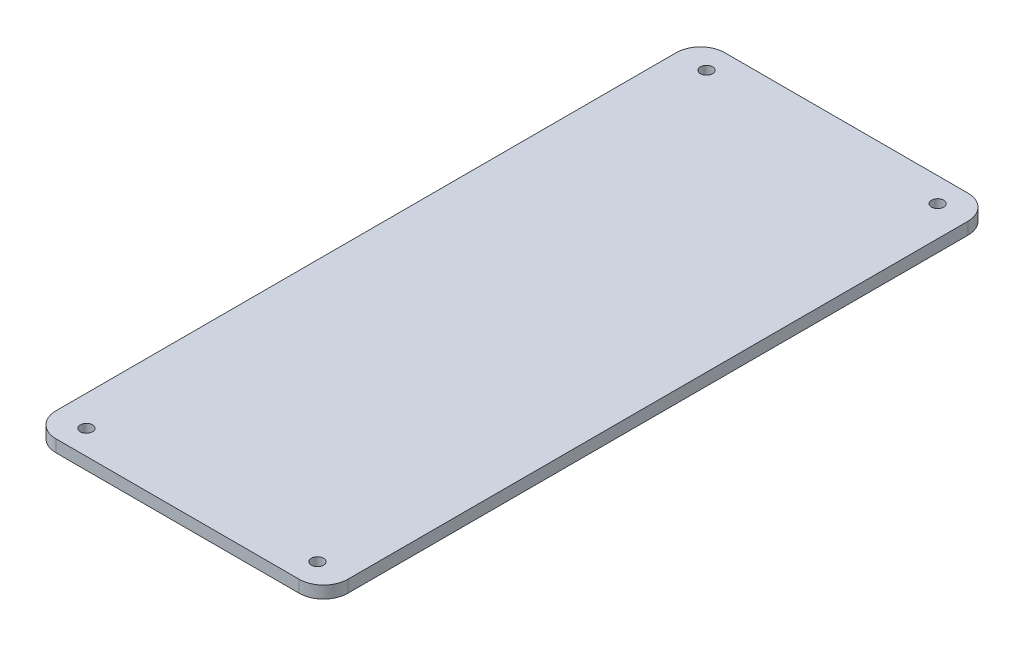
ISO-10303-21;
HEADER;
FILE_DESCRIPTION(('STEP AP214'),'2;1');
FILE_NAME('part.step','',(''),(''),'','','');
FILE_SCHEMA(('AUTOMOTIVE_DESIGN { 1 0 10303 214 1 1 1 1 }'));
ENDSEC;
DATA;
#1=APPLICATION_CONTEXT('core data for automotive mechanical design processes');
#2=APPLICATION_PROTOCOL_DEFINITION('international standard','automotive_design',2000,#1);
#3=PRODUCT_CONTEXT('',#1,'mechanical');
#4=PRODUCT('Part','Part','',(#3));
#5=PRODUCT_RELATED_PRODUCT_CATEGORY('part','',(#4));
#6=PRODUCT_DEFINITION_FORMATION('','',#4);
#7=PRODUCT_DEFINITION_CONTEXT('part definition',#1,'design');
#8=PRODUCT_DEFINITION('design','',#6,#7);
#9=PRODUCT_DEFINITION_SHAPE('','',#8);
#10=(LENGTH_UNIT() NAMED_UNIT(*) SI_UNIT(.MILLI.,.METRE.));
#11=(NAMED_UNIT(*) PLANE_ANGLE_UNIT() SI_UNIT($,.RADIAN.));
#12=(NAMED_UNIT(*) SI_UNIT($,.STERADIAN.) SOLID_ANGLE_UNIT());
#13=UNCERTAINTY_MEASURE_WITH_UNIT(LENGTH_MEASURE(1.E-05),#10,'distance_accuracy_value','');
#14=(GEOMETRIC_REPRESENTATION_CONTEXT(3) GLOBAL_UNCERTAINTY_ASSIGNED_CONTEXT((#13)) GLOBAL_UNIT_ASSIGNED_CONTEXT((#10,
#11,#12)) REPRESENTATION_CONTEXT('',''));
#15=CARTESIAN_POINT('',(0.,0.,0.));
#16=DIRECTION('',(0.,0.,1.));
#17=DIRECTION('',(1.,0.,0.));
#18=AXIS2_PLACEMENT_3D('',#15,#16,#17);
#19=CARTESIAN_POINT('',(30.,3.,-76.5));
#20=DIRECTION('',(0.,-1.,0.));
#21=DIRECTION('',(0.,0.,-1.));
#22=AXIS2_PLACEMENT_3D('',#19,#20,#21);
#23=PLANE('',#22);
#24=CARTESIAN_POINT('',(30.,3.,-76.5));
#25=DIRECTION('',(0.,1.,0.));
#26=DIRECTION('',(0.,0.,-1.));
#27=AXIS2_PLACEMENT_3D('',#24,#25,#26);
#28=CIRCLE('',#27,5.99999999999999);
#29=CARTESIAN_POINT('',(36.,3.,-76.5));
#30=VERTEX_POINT('',#29);
#31=CARTESIAN_POINT('',(30.,3.,-82.5));
#32=VERTEX_POINT('',#31);
#33=EDGE_CURVE('E151',#30,#32,#28,.T.);
#34=ORIENTED_EDGE('',*,*,#33,.T.);
#35=DIRECTION('',(-1.,0.,0.));
#36=VECTOR('',#35,1.);
#37=CARTESIAN_POINT('',(-30.,3.,-82.5));
#38=LINE('',#37,#36);
#39=CARTESIAN_POINT('',(-30.,3.,-82.5));
#40=VERTEX_POINT('',#39);
#41=EDGE_CURVE('E99',#32,#40,#38,.T.);
#42=ORIENTED_EDGE('',*,*,#41,.T.);
#43=CARTESIAN_POINT('',(-30.,3.,-76.5));
#44=DIRECTION('',(0.,1.,0.));
#45=DIRECTION('',(0.,0.,-1.));
#46=AXIS2_PLACEMENT_3D('',#43,#44,#45);
#47=CIRCLE('',#46,6.);
#48=CARTESIAN_POINT('',(-36.,3.,-76.5));
#49=VERTEX_POINT('',#48);
#50=EDGE_CURVE('E166',#40,#49,#47,.T.);
#51=ORIENTED_EDGE('',*,*,#50,.T.);
#52=DIRECTION('',(0.,0.,1.));
#53=VECTOR('',#52,1.);
#54=CARTESIAN_POINT('',(-36.,3.,76.5));
#55=LINE('',#54,#53);
#56=CARTESIAN_POINT('',(-36.,3.,76.5));
#57=VERTEX_POINT('',#56);
#58=EDGE_CURVE('E179',#49,#57,#55,.T.);
#59=ORIENTED_EDGE('',*,*,#58,.T.);
#60=CARTESIAN_POINT('',(-30.,3.,76.5));
#61=DIRECTION('',(0.,1.,0.));
#62=DIRECTION('',(0.,0.,-1.));
#63=AXIS2_PLACEMENT_3D('',#60,#61,#62);
#64=CIRCLE('',#63,6.00000000000001);
#65=CARTESIAN_POINT('',(-30.,3.,82.5));
#66=VERTEX_POINT('',#65);
#67=EDGE_CURVE('E118',#57,#66,#64,.T.);
#68=ORIENTED_EDGE('',*,*,#67,.T.);
#69=DIRECTION('',(1.,0.,0.));
#70=VECTOR('',#69,1.);
#71=CARTESIAN_POINT('',(-30.,3.,82.5));
#72=LINE('',#71,#70);
#73=CARTESIAN_POINT('',(30.,3.,82.5));
#74=VERTEX_POINT('',#73);
#75=EDGE_CURVE('E112',#66,#74,#72,.T.);
#76=ORIENTED_EDGE('',*,*,#75,.T.);
#77=CARTESIAN_POINT('',(30.,3.,76.5));
#78=DIRECTION('',(0.,1.,0.));
#79=DIRECTION('',(0.,0.,-1.));
#80=AXIS2_PLACEMENT_3D('',#77,#78,#79);
#81=CIRCLE('',#80,6.00000000000001);
#82=CARTESIAN_POINT('',(36.,3.,76.5));
#83=VERTEX_POINT('',#82);
#84=EDGE_CURVE('E116',#74,#83,#81,.T.);
#85=ORIENTED_EDGE('',*,*,#84,.T.);
#86=DIRECTION('',(0.,0.,-1.));
#87=VECTOR('',#86,1.);
#88=CARTESIAN_POINT('',(36.,3.,76.5));
#89=LINE('',#88,#87);
#90=EDGE_CURVE('E56',#83,#30,#89,.T.);
#91=ORIENTED_EDGE('',*,*,#90,.T.);
#92=EDGE_LOOP('',(#34,#42,#51,#59,#68,#76,#85,#91));
#93=FACE_BOUND('',#92,.T.);
#94=CARTESIAN_POINT('',(28.5,3.,76.5));
#95=DIRECTION('',(0.,1.,0.));
#96=DIRECTION('',(0.,0.,1.));
#97=AXIS2_PLACEMENT_3D('',#94,#95,#96);
#98=CIRCLE('',#97,1.50000000000005);
#99=CARTESIAN_POINT('',(28.5,3.,78.0000000000001));
#100=VERTEX_POINT('',#99);
#101=EDGE_CURVE('E140',#100,#100,#98,.T.);
#102=ORIENTED_EDGE('',*,*,#101,.F.);
#103=EDGE_LOOP('',(#102));
#104=FACE_BOUND('',#103,.T.);
#105=CARTESIAN_POINT('',(-28.5,3.,76.5));
#106=DIRECTION('',(0.,1.,0.));
#107=DIRECTION('',(0.,0.,1.));
#108=AXIS2_PLACEMENT_3D('',#105,#106,#107);
#109=CIRCLE('',#108,1.50000000000005);
#110=CARTESIAN_POINT('',(-28.5,3.,78.0000000000001));
#111=VERTEX_POINT('',#110);
#112=EDGE_CURVE('E188',#111,#111,#109,.T.);
#113=ORIENTED_EDGE('',*,*,#112,.F.);
#114=EDGE_LOOP('',(#113));
#115=FACE_BOUND('',#114,.T.);
#116=CARTESIAN_POINT('',(28.5,3.,-76.5));
#117=DIRECTION('',(0.,1.,0.));
#118=DIRECTION('',(0.,0.,1.));
#119=AXIS2_PLACEMENT_3D('',#116,#117,#118);
#120=CIRCLE('',#119,1.50000000000008);
#121=CARTESIAN_POINT('',(28.5,3.,-74.9999999999999));
#122=VERTEX_POINT('',#121);
#123=EDGE_CURVE('E194',#122,#122,#120,.T.);
#124=ORIENTED_EDGE('',*,*,#123,.F.);
#125=EDGE_LOOP('',(#124));
#126=FACE_BOUND('',#125,.T.);
#127=CARTESIAN_POINT('',(-28.5000000000001,3.,-76.5));
#128=DIRECTION('',(0.,1.,0.));
#129=DIRECTION('',(0.,0.,1.));
#130=AXIS2_PLACEMENT_3D('',#127,#128,#129);
#131=CIRCLE('',#130,1.50000000000008);
#132=CARTESIAN_POINT('',(-28.5000000000001,3.,-74.9999999999999));
#133=VERTEX_POINT('',#132);
#134=EDGE_CURVE('E200',#133,#133,#131,.T.);
#135=ORIENTED_EDGE('',*,*,#134,.F.);
#136=EDGE_LOOP('',(#135));
#137=FACE_BOUND('',#136,.T.);
#138=ADVANCED_FACE('F39',(#93,#104,#115,#126,#137),#23,.F.);
#139=CARTESIAN_POINT('',(30.,0.,-76.5));
#140=DIRECTION('',(0.,-1.,0.));
#141=DIRECTION('',(0.,0.,-1.));
#142=AXIS2_PLACEMENT_3D('',#139,#140,#141);
#143=PLANE('',#142);
#144=CARTESIAN_POINT('',(28.5,0.,-76.5));
#145=DIRECTION('',(0.,1.,0.));
#146=DIRECTION('',(0.,0.,1.));
#147=AXIS2_PLACEMENT_3D('',#144,#145,#146);
#148=CIRCLE('',#147,1.50000000000008);
#149=CARTESIAN_POINT('',(28.5,0.,-74.9999999999999));
#150=VERTEX_POINT('',#149);
#151=EDGE_CURVE('E197',#150,#150,#148,.T.);
#152=ORIENTED_EDGE('',*,*,#151,.T.);
#153=EDGE_LOOP('',(#152));
#154=FACE_BOUND('',#153,.T.);
#155=CARTESIAN_POINT('',(28.5,0.,76.5));
#156=DIRECTION('',(0.,1.,0.));
#157=DIRECTION('',(0.,0.,1.));
#158=AXIS2_PLACEMENT_3D('',#155,#156,#157);
#159=CIRCLE('',#158,1.50000000000005);
#160=CARTESIAN_POINT('',(28.5,0.,78.0000000000001));
#161=VERTEX_POINT('',#160);
#162=EDGE_CURVE('E185',#161,#161,#159,.T.);
#163=ORIENTED_EDGE('',*,*,#162,.T.);
#164=EDGE_LOOP('',(#163));
#165=FACE_BOUND('',#164,.T.);
#166=CARTESIAN_POINT('',(30.,0.,-76.5));
#167=DIRECTION('',(0.,1.,0.));
#168=DIRECTION('',(0.,0.,-1.));
#169=AXIS2_PLACEMENT_3D('',#166,#167,#168);
#170=CIRCLE('',#169,5.99999999999999);
#171=CARTESIAN_POINT('',(36.,0.,-76.5));
#172=VERTEX_POINT('',#171);
#173=CARTESIAN_POINT('',(30.,0.,-82.5));
#174=VERTEX_POINT('',#173);
#175=EDGE_CURVE('E136',#172,#174,#170,.T.);
#176=ORIENTED_EDGE('',*,*,#175,.F.);
#177=DIRECTION('',(0.,0.,-1.));
#178=VECTOR('',#177,1.);
#179=CARTESIAN_POINT('',(36.,0.,76.5));
#180=LINE('',#179,#178);
#181=CARTESIAN_POINT('',(36.,0.,76.5));
#182=VERTEX_POINT('',#181);
#183=EDGE_CURVE('E91',#182,#172,#180,.T.);
#184=ORIENTED_EDGE('',*,*,#183,.F.);
#185=CARTESIAN_POINT('',(30.,0.,76.5));
#186=DIRECTION('',(0.,1.,0.));
#187=DIRECTION('',(0.,0.,-1.));
#188=AXIS2_PLACEMENT_3D('',#185,#186,#187);
#189=CIRCLE('',#188,6.00000000000001);
#190=CARTESIAN_POINT('',(30.,0.,82.5));
#191=VERTEX_POINT('',#190);
#192=EDGE_CURVE('E85',#191,#182,#189,.T.);
#193=ORIENTED_EDGE('',*,*,#192,.F.);
#194=DIRECTION('',(1.,0.,0.));
#195=VECTOR('',#194,1.);
#196=CARTESIAN_POINT('',(-30.,0.,82.5));
#197=LINE('',#196,#195);
#198=CARTESIAN_POINT('',(-30.,0.,82.5));
#199=VERTEX_POINT('',#198);
#200=EDGE_CURVE('E126',#199,#191,#197,.T.);
#201=ORIENTED_EDGE('',*,*,#200,.F.);
#202=CARTESIAN_POINT('',(-30.,0.,76.5));
#203=DIRECTION('',(0.,1.,0.));
#204=DIRECTION('',(0.,0.,-1.));
#205=AXIS2_PLACEMENT_3D('',#202,#203,#204);
#206=CIRCLE('',#205,6.00000000000001);
#207=CARTESIAN_POINT('',(-36.,0.,76.5));
#208=VERTEX_POINT('',#207);
#209=EDGE_CURVE('E146',#208,#199,#206,.T.);
#210=ORIENTED_EDGE('',*,*,#209,.F.);
#211=DIRECTION('',(0.,0.,1.));
#212=VECTOR('',#211,1.);
#213=CARTESIAN_POINT('',(-36.,0.,76.5));
#214=LINE('',#213,#212);
#215=CARTESIAN_POINT('',(-36.,0.,-76.5));
#216=VERTEX_POINT('',#215);
#217=EDGE_CURVE('E144',#216,#208,#214,.T.);
#218=ORIENTED_EDGE('',*,*,#217,.F.);
#219=CARTESIAN_POINT('',(-30.,0.,-76.5));
#220=DIRECTION('',(0.,1.,0.));
#221=DIRECTION('',(0.,0.,-1.));
#222=AXIS2_PLACEMENT_3D('',#219,#220,#221);
#223=CIRCLE('',#222,6.);
#224=CARTESIAN_POINT('',(-30.,0.,-82.5));
#225=VERTEX_POINT('',#224);
#226=EDGE_CURVE('E142',#225,#216,#223,.T.);
#227=ORIENTED_EDGE('',*,*,#226,.F.);
#228=DIRECTION('',(-1.,0.,0.));
#229=VECTOR('',#228,1.);
#230=CARTESIAN_POINT('',(-30.,0.,-82.5));
#231=LINE('',#230,#229);
#232=EDGE_CURVE('E139',#174,#225,#231,.T.);
#233=ORIENTED_EDGE('',*,*,#232,.F.);
#234=EDGE_LOOP('',(#176,#184,#193,#201,#210,#218,#227,#233));
#235=FACE_BOUND('',#234,.T.);
#236=CARTESIAN_POINT('',(-28.5,0.,76.5));
#237=DIRECTION('',(0.,1.,0.));
#238=DIRECTION('',(0.,0.,1.));
#239=AXIS2_PLACEMENT_3D('',#236,#237,#238);
#240=CIRCLE('',#239,1.50000000000005);
#241=CARTESIAN_POINT('',(-28.5,0.,78.0000000000001));
#242=VERTEX_POINT('',#241);
#243=EDGE_CURVE('E191',#242,#242,#240,.T.);
#244=ORIENTED_EDGE('',*,*,#243,.T.);
#245=EDGE_LOOP('',(#244));
#246=FACE_BOUND('',#245,.T.);
#247=CARTESIAN_POINT('',(-28.5000000000001,0.,-76.5));
#248=DIRECTION('',(0.,1.,0.));
#249=DIRECTION('',(0.,0.,1.));
#250=AXIS2_PLACEMENT_3D('',#247,#248,#249);
#251=CIRCLE('',#250,1.50000000000008);
#252=CARTESIAN_POINT('',(-28.5000000000001,0.,-74.9999999999999));
#253=VERTEX_POINT('',#252);
#254=EDGE_CURVE('E203',#253,#253,#251,.T.);
#255=ORIENTED_EDGE('',*,*,#254,.T.);
#256=EDGE_LOOP('',(#255));
#257=FACE_BOUND('',#256,.T.);
#258=ADVANCED_FACE('F170',(#154,#165,#235,#246,#257),#143,.T.);
#259=CARTESIAN_POINT('',(30.,3.,-76.5));
#260=DIRECTION('',(0.,-1.,0.));
#261=DIRECTION('',(0.,0.,-1.));
#262=AXIS2_PLACEMENT_3D('',#259,#260,#261);
#263=CYLINDRICAL_SURFACE('',#262,5.99999999999999);
#264=ORIENTED_EDGE('',*,*,#175,.T.);
#265=DIRECTION('',(0.,-1.,0.));
#266=VECTOR('',#265,1.);
#267=CARTESIAN_POINT('',(30.,3.,-82.5));
#268=LINE('',#267,#266);
#269=EDGE_CURVE('E11',#32,#174,#268,.T.);
#270=ORIENTED_EDGE('',*,*,#269,.F.);
#271=ORIENTED_EDGE('',*,*,#33,.F.);
#272=DIRECTION('',(0.,-1.,0.));
#273=VECTOR('',#272,1.);
#274=CARTESIAN_POINT('',(36.,3.,-76.5));
#275=LINE('',#274,#273);
#276=EDGE_CURVE('E132',#30,#172,#275,.T.);
#277=ORIENTED_EDGE('',*,*,#276,.T.);
#278=EDGE_LOOP('',(#264,#270,#271,#277));
#279=FACE_BOUND('',#278,.T.);
#280=ADVANCED_FACE('F41',(#279),#263,.T.);
#281=CARTESIAN_POINT('',(-30.,3.,-82.5));
#282=DIRECTION('',(0.,0.,1.));
#283=DIRECTION('',(1.,0.,0.));
#284=AXIS2_PLACEMENT_3D('',#281,#282,#283);
#285=PLANE('',#284);
#286=ORIENTED_EDGE('',*,*,#232,.T.);
#287=DIRECTION('',(0.,-1.,0.));
#288=VECTOR('',#287,1.);
#289=CARTESIAN_POINT('',(-30.,3.,-82.5));
#290=LINE('',#289,#288);
#291=EDGE_CURVE('E48',#40,#225,#290,.T.);
#292=ORIENTED_EDGE('',*,*,#291,.F.);
#293=ORIENTED_EDGE('',*,*,#41,.F.);
#294=ORIENTED_EDGE('',*,*,#269,.T.);
#295=EDGE_LOOP('',(#286,#292,#293,#294));
#296=FACE_BOUND('',#295,.T.);
#297=ADVANCED_FACE('F235',(#296),#285,.F.);
#298=CARTESIAN_POINT('',(-30.,3.,-76.5));
#299=DIRECTION('',(0.,-1.,0.));
#300=DIRECTION('',(0.,0.,-1.));
#301=AXIS2_PLACEMENT_3D('',#298,#299,#300);
#302=CYLINDRICAL_SURFACE('',#301,6.);
#303=ORIENTED_EDGE('',*,*,#226,.T.);
#304=DIRECTION('',(0.,-1.,0.));
#305=VECTOR('',#304,1.);
#306=CARTESIAN_POINT('',(-36.,3.,-76.5));
#307=LINE('',#306,#305);
#308=EDGE_CURVE('E158',#49,#216,#307,.T.);
#309=ORIENTED_EDGE('',*,*,#308,.F.);
#310=ORIENTED_EDGE('',*,*,#50,.F.);
#311=ORIENTED_EDGE('',*,*,#291,.T.);
#312=EDGE_LOOP('',(#303,#309,#310,#311));
#313=FACE_BOUND('',#312,.T.);
#314=ADVANCED_FACE('F164',(#313),#302,.T.);
#315=CARTESIAN_POINT('',(-36.,3.,76.5));
#316=DIRECTION('',(1.,0.,0.));
#317=DIRECTION('',(0.,0.,-1.));
#318=AXIS2_PLACEMENT_3D('',#315,#316,#317);
#319=PLANE('',#318);
#320=ORIENTED_EDGE('',*,*,#217,.T.);
#321=DIRECTION('',(0.,-1.,0.));
#322=VECTOR('',#321,1.);
#323=CARTESIAN_POINT('',(-36.,3.,76.5));
#324=LINE('',#323,#322);
#325=EDGE_CURVE('E155',#57,#208,#324,.T.);
#326=ORIENTED_EDGE('',*,*,#325,.F.);
#327=ORIENTED_EDGE('',*,*,#58,.F.);
#328=ORIENTED_EDGE('',*,*,#308,.T.);
#329=EDGE_LOOP('',(#320,#326,#327,#328));
#330=FACE_BOUND('',#329,.T.);
#331=ADVANCED_FACE('F175',(#330),#319,.F.);
#332=CARTESIAN_POINT('',(-30.,3.,76.5));
#333=DIRECTION('',(0.,-1.,0.));
#334=DIRECTION('',(0.,0.,-1.));
#335=AXIS2_PLACEMENT_3D('',#332,#333,#334);
#336=CYLINDRICAL_SURFACE('',#335,6.00000000000001);
#337=ORIENTED_EDGE('',*,*,#209,.T.);
#338=DIRECTION('',(0.,-1.,0.));
#339=VECTOR('',#338,1.);
#340=CARTESIAN_POINT('',(-30.,3.,82.5));
#341=LINE('',#340,#339);
#342=EDGE_CURVE('E127',#66,#199,#341,.T.);
#343=ORIENTED_EDGE('',*,*,#342,.F.);
#344=ORIENTED_EDGE('',*,*,#67,.F.);
#345=ORIENTED_EDGE('',*,*,#325,.T.);
#346=EDGE_LOOP('',(#337,#343,#344,#345));
#347=FACE_BOUND('',#346,.T.);
#348=ADVANCED_FACE('F178',(#347),#336,.T.);
#349=CARTESIAN_POINT('',(-30.,3.,82.5));
#350=DIRECTION('',(0.,0.,-1.));
#351=DIRECTION('',(-1.,0.,0.));
#352=AXIS2_PLACEMENT_3D('',#349,#350,#351);
#353=PLANE('',#352);
#354=ORIENTED_EDGE('',*,*,#200,.T.);
#355=DIRECTION('',(0.,-1.,0.));
#356=VECTOR('',#355,1.);
#357=CARTESIAN_POINT('',(30.,3.,82.5));
#358=LINE('',#357,#356);
#359=EDGE_CURVE('E123',#74,#191,#358,.T.);
#360=ORIENTED_EDGE('',*,*,#359,.F.);
#361=ORIENTED_EDGE('',*,*,#75,.F.);
#362=ORIENTED_EDGE('',*,*,#342,.T.);
#363=EDGE_LOOP('',(#354,#360,#361,#362));
#364=FACE_BOUND('',#363,.T.);
#365=ADVANCED_FACE('F124',(#364),#353,.F.);
#366=CARTESIAN_POINT('',(30.,3.,76.5));
#367=DIRECTION('',(0.,-1.,0.));
#368=DIRECTION('',(0.,0.,-1.));
#369=AXIS2_PLACEMENT_3D('',#366,#367,#368);
#370=CYLINDRICAL_SURFACE('',#369,6.00000000000001);
#371=ORIENTED_EDGE('',*,*,#192,.T.);
#372=DIRECTION('',(0.,-1.,0.));
#373=VECTOR('',#372,1.);
#374=CARTESIAN_POINT('',(36.,3.,76.5));
#375=LINE('',#374,#373);
#376=EDGE_CURVE('E128',#83,#182,#375,.T.);
#377=ORIENTED_EDGE('',*,*,#376,.F.);
#378=ORIENTED_EDGE('',*,*,#84,.F.);
#379=ORIENTED_EDGE('',*,*,#359,.T.);
#380=EDGE_LOOP('',(#371,#377,#378,#379));
#381=FACE_BOUND('',#380,.T.);
#382=ADVANCED_FACE('F130',(#381),#370,.T.);
#383=CARTESIAN_POINT('',(36.,3.,76.5));
#384=DIRECTION('',(-1.,0.,0.));
#385=DIRECTION('',(0.,0.,1.));
#386=AXIS2_PLACEMENT_3D('',#383,#384,#385);
#387=PLANE('',#386);
#388=ORIENTED_EDGE('',*,*,#183,.T.);
#389=ORIENTED_EDGE('',*,*,#276,.F.);
#390=ORIENTED_EDGE('',*,*,#90,.F.);
#391=ORIENTED_EDGE('',*,*,#376,.T.);
#392=EDGE_LOOP('',(#388,#389,#390,#391));
#393=FACE_BOUND('',#392,.T.);
#394=ADVANCED_FACE('F223',(#393),#387,.F.);
#395=CARTESIAN_POINT('',(28.5,3.,76.5));
#396=DIRECTION('',(0.,-1.,0.));
#397=DIRECTION('',(0.,0.,-1.));
#398=AXIS2_PLACEMENT_3D('',#395,#396,#397);
#399=CYLINDRICAL_SURFACE('',#398,1.50000000000005);
#400=ORIENTED_EDGE('',*,*,#101,.T.);
#401=EDGE_LOOP('',(#400));
#402=FACE_BOUND('',#401,.T.);
#403=ORIENTED_EDGE('',*,*,#162,.F.);
#404=EDGE_LOOP('',(#403));
#405=FACE_BOUND('',#404,.T.);
#406=ADVANCED_FACE('F220',(#402,#405),#399,.F.);
#407=CARTESIAN_POINT('',(-28.5,3.,76.5));
#408=DIRECTION('',(0.,-1.,0.));
#409=DIRECTION('',(0.,0.,-1.));
#410=AXIS2_PLACEMENT_3D('',#407,#408,#409);
#411=CYLINDRICAL_SURFACE('',#410,1.50000000000005);
#412=ORIENTED_EDGE('',*,*,#112,.T.);
#413=EDGE_LOOP('',(#412));
#414=FACE_BOUND('',#413,.T.);
#415=ORIENTED_EDGE('',*,*,#243,.F.);
#416=EDGE_LOOP('',(#415));
#417=FACE_BOUND('',#416,.T.);
#418=ADVANCED_FACE('F298',(#414,#417),#411,.F.);
#419=CARTESIAN_POINT('',(28.5,3.,-76.5));
#420=DIRECTION('',(0.,-1.,0.));
#421=DIRECTION('',(0.,0.,-1.));
#422=AXIS2_PLACEMENT_3D('',#419,#420,#421);
#423=CYLINDRICAL_SURFACE('',#422,1.50000000000008);
#424=ORIENTED_EDGE('',*,*,#123,.T.);
#425=EDGE_LOOP('',(#424));
#426=FACE_BOUND('',#425,.T.);
#427=ORIENTED_EDGE('',*,*,#151,.F.);
#428=EDGE_LOOP('',(#427));
#429=FACE_BOUND('',#428,.T.);
#430=ADVANCED_FACE('F306',(#426,#429),#423,.F.);
#431=CARTESIAN_POINT('',(-28.5000000000001,3.,-76.5));
#432=DIRECTION('',(0.,-1.,0.));
#433=DIRECTION('',(0.,0.,-1.));
#434=AXIS2_PLACEMENT_3D('',#431,#432,#433);
#435=CYLINDRICAL_SURFACE('',#434,1.50000000000008);
#436=ORIENTED_EDGE('',*,*,#134,.T.);
#437=EDGE_LOOP('',(#436));
#438=FACE_BOUND('',#437,.T.);
#439=ORIENTED_EDGE('',*,*,#254,.F.);
#440=EDGE_LOOP('',(#439));
#441=FACE_BOUND('',#440,.T.);
#442=ADVANCED_FACE('F209',(#438,#441),#435,.F.);
#443=CLOSED_SHELL('',(#138,#258,#280,#297,#314,#331,#348,#365,#382,#394,#406,#418,#430,#442));
#444=MANIFOLD_SOLID_BREP('B2',#443);
#445=ADVANCED_BREP_SHAPE_REPRESENTATION('',(#18,#444),#14);
#446=SHAPE_DEFINITION_REPRESENTATION(#9,#445);
ENDSEC;
END-ISO-10303-21;
